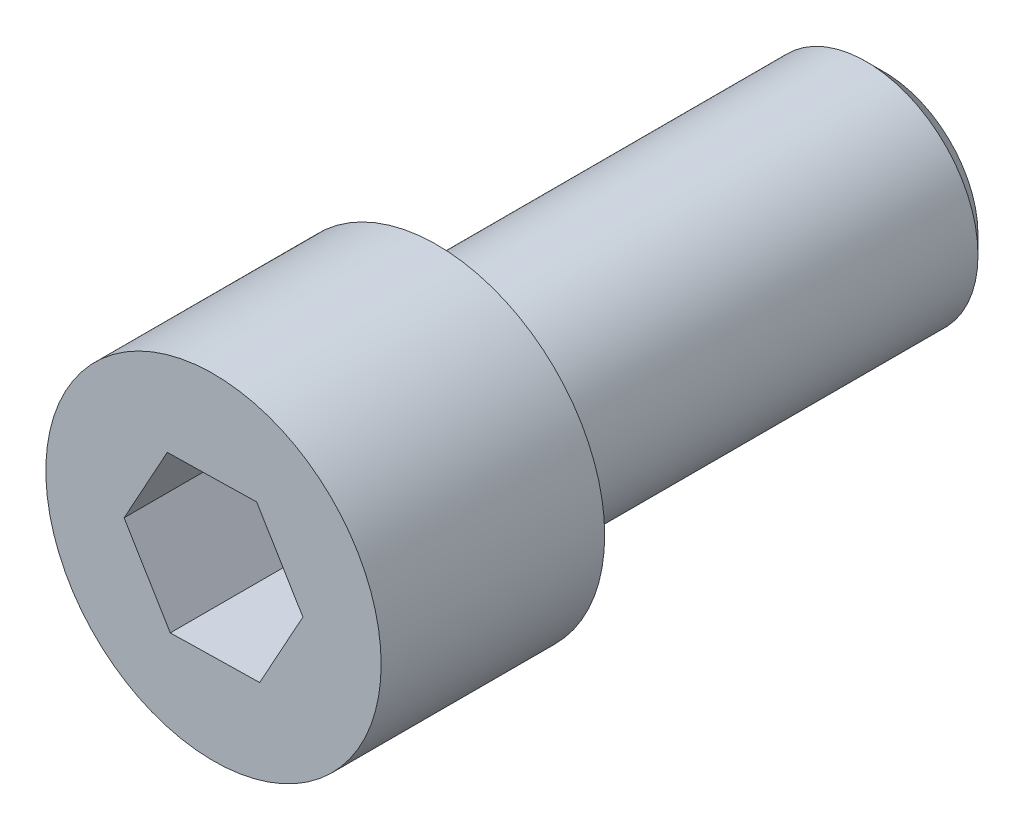
ISO-10303-21;
HEADER;
FILE_DESCRIPTION(('STEP AP214'),'2;1');
FILE_NAME('part.step','',(''),(''),'','','');
FILE_SCHEMA(('AUTOMOTIVE_DESIGN { 1 0 10303 214 1 1 1 1 }'));
ENDSEC;
DATA;
#1=APPLICATION_CONTEXT('core data for automotive mechanical design processes');
#2=APPLICATION_PROTOCOL_DEFINITION('international standard','automotive_design',2000,#1);
#3=PRODUCT_CONTEXT('',#1,'mechanical');
#4=PRODUCT('Part','Part','',(#3));
#5=PRODUCT_RELATED_PRODUCT_CATEGORY('part','',(#4));
#6=PRODUCT_DEFINITION_FORMATION('','',#4);
#7=PRODUCT_DEFINITION_CONTEXT('part definition',#1,'design');
#8=PRODUCT_DEFINITION('design','',#6,#7);
#9=PRODUCT_DEFINITION_SHAPE('','',#8);
#10=(LENGTH_UNIT() NAMED_UNIT(*) SI_UNIT(.MILLI.,.METRE.));
#11=(NAMED_UNIT(*) PLANE_ANGLE_UNIT() SI_UNIT($,.RADIAN.));
#12=(NAMED_UNIT(*) SI_UNIT($,.STERADIAN.) SOLID_ANGLE_UNIT());
#13=UNCERTAINTY_MEASURE_WITH_UNIT(LENGTH_MEASURE(1.E-05),#10,'distance_accuracy_value','');
#14=(GEOMETRIC_REPRESENTATION_CONTEXT(3) GLOBAL_UNCERTAINTY_ASSIGNED_CONTEXT((#13)) GLOBAL_UNIT_ASSIGNED_CONTEXT((#10,
#11,#12)) REPRESENTATION_CONTEXT('',''));
#15=CARTESIAN_POINT('',(0.,0.,0.));
#16=DIRECTION('',(0.,0.,1.));
#17=DIRECTION('',(1.,0.,0.));
#18=AXIS2_PLACEMENT_3D('',#15,#16,#17);
#19=CARTESIAN_POINT('',(-30.0924150638532,3.61445208867511,6.35));
#20=DIRECTION('',(0.,0.,-1.));
#21=DIRECTION('',(-1.,0.,0.));
#22=AXIS2_PLACEMENT_3D('',#19,#20,#21);
#23=CYLINDRICAL_SURFACE('',#22,4.7625);
#24=CARTESIAN_POINT('',(-30.0924150638532,3.61445208867511,6.35));
#25=DIRECTION('',(0.,0.,1.));
#26=DIRECTION('',(1.,0.,0.));
#27=AXIS2_PLACEMENT_3D('',#24,#25,#26);
#28=CIRCLE('',#27,4.7625);
#29=CARTESIAN_POINT('',(-25.3299150638532,3.61445208867511,6.35));
#30=VERTEX_POINT('',#29);
#31=EDGE_CURVE('E142',#30,#30,#28,.T.);
#32=ORIENTED_EDGE('',*,*,#31,.F.);
#33=EDGE_LOOP('',(#32));
#34=FACE_BOUND('',#33,.T.);
#35=CARTESIAN_POINT('',(-30.0924150638532,3.61445208867511,0.));
#36=DIRECTION('',(0.,0.,1.));
#37=DIRECTION('',(1.,0.,0.));
#38=AXIS2_PLACEMENT_3D('',#35,#36,#37);
#39=CIRCLE('',#38,4.7625);
#40=CARTESIAN_POINT('',(-25.3299150638532,3.61445208867511,0.));
#41=VERTEX_POINT('',#40);
#42=EDGE_CURVE('E136',#41,#41,#39,.T.);
#43=ORIENTED_EDGE('',*,*,#42,.T.);
#44=EDGE_LOOP('',(#43));
#45=FACE_BOUND('',#44,.T.);
#46=ADVANCED_FACE('F34',(#34,#45),#23,.T.);
#47=CARTESIAN_POINT('',(-30.0924150638532,3.61445208867511,6.35));
#48=DIRECTION('',(0.,0.,1.));
#49=DIRECTION('',(1.,0.,0.));
#50=AXIS2_PLACEMENT_3D('',#47,#48,#49);
#51=PLANE('',#50);
#52=DIRECTION('',(0.999814238001745,0.0192740625969401,0.));
#53=VECTOR('',#52,1.);
#54=CARTESIAN_POINT('',(-31.3197819033928,1.39067812507277,6.35));
#55=LINE('',#54,#53);
#56=CARTESIAN_POINT('',(-31.3197819033928,1.39067812507277,6.35));
#57=VERTEX_POINT('',#56);
#58=CARTESIAN_POINT('',(-28.7802537388683,1.439634244069,6.35));
#59=VERTEX_POINT('',#58);
#60=EDGE_CURVE('E49',#57,#59,#55,.T.);
#61=ORIENTED_EDGE('',*,*,#60,.F.);
#62=DIRECTION('',(0.516598946843954,-0.856227497876422,0.));
#63=VECTOR('',#62,1.);
#64=CARTESIAN_POINT('',(-32.6319432283764,3.56549596967889,6.35));
#65=LINE('',#64,#63);
#66=CARTESIAN_POINT('',(-32.6319432283764,3.56549596967889,6.35));
#67=VERTEX_POINT('',#66);
#68=EDGE_CURVE('E132',#67,#57,#65,.T.);
#69=ORIENTED_EDGE('',*,*,#68,.F.);
#70=DIRECTION('',(-0.483215291157794,-0.87550156047336,0.));
#71=VECTOR('',#70,1.);
#72=CARTESIAN_POINT('',(-31.4045763888356,5.78926993328122,6.35));
#73=LINE('',#72,#71);
#74=CARTESIAN_POINT('',(-31.4045763888356,5.78926993328122,6.35));
#75=VERTEX_POINT('',#74);
#76=EDGE_CURVE('E130',#75,#67,#73,.T.);
#77=ORIENTED_EDGE('',*,*,#76,.F.);
#78=DIRECTION('',(-0.999814238001745,-0.0192740625969398,0.));
#79=VECTOR('',#78,1.);
#80=CARTESIAN_POINT('',(-28.8650482243112,5.83822605227745,6.35));
#81=LINE('',#80,#79);
#82=CARTESIAN_POINT('',(-28.8650482243112,5.83822605227745,6.35));
#83=VERTEX_POINT('',#82);
#84=EDGE_CURVE('E97',#83,#75,#81,.T.);
#85=ORIENTED_EDGE('',*,*,#84,.F.);
#86=DIRECTION('',(-0.516598946843954,0.856227497876422,0.));
#87=VECTOR('',#86,1.);
#88=CARTESIAN_POINT('',(-27.5528868993275,3.66340820767134,6.35));
#89=LINE('',#88,#87);
#90=CARTESIAN_POINT('',(-27.5528868993275,3.66340820767134,6.35));
#91=VERTEX_POINT('',#90);
#92=EDGE_CURVE('E126',#91,#83,#89,.T.);
#93=ORIENTED_EDGE('',*,*,#92,.F.);
#94=DIRECTION('',(0.483215291157791,0.875501560473362,0.));
#95=VECTOR('',#94,1.);
#96=CARTESIAN_POINT('',(-28.7802537388683,1.439634244069,6.35));
#97=LINE('',#96,#95);
#98=EDGE_CURVE('E123',#59,#91,#97,.T.);
#99=ORIENTED_EDGE('',*,*,#98,.F.);
#100=EDGE_LOOP('',(#61,#69,#77,#85,#93,#99));
#101=FACE_BOUND('',#100,.T.);
#102=ORIENTED_EDGE('',*,*,#31,.T.);
#103=EDGE_LOOP('',(#102));
#104=FACE_BOUND('',#103,.T.);
#105=ADVANCED_FACE('F166',(#101,#104),#51,.T.);
#106=CARTESIAN_POINT('',(-30.0924150638532,3.61445208867511,0.));
#107=DIRECTION('',(0.,0.,1.));
#108=DIRECTION('',(1.,0.,0.));
#109=AXIS2_PLACEMENT_3D('',#106,#107,#108);
#110=PLANE('',#109);
#111=CARTESIAN_POINT('',(-30.0924150638532,3.61445208867511,0.));
#112=DIRECTION('',(0.,0.,1.));
#113=DIRECTION('',(1.,0.,0.));
#114=AXIS2_PLACEMENT_3D('',#111,#112,#113);
#115=CIRCLE('',#114,3.556);
#116=CARTESIAN_POINT('',(-26.5364150638532,3.61445208867511,0.));
#117=VERTEX_POINT('',#116);
#118=EDGE_CURVE('E150',#117,#117,#115,.T.);
#119=ORIENTED_EDGE('',*,*,#118,.T.);
#120=EDGE_LOOP('',(#119));
#121=FACE_BOUND('',#120,.T.);
#122=ORIENTED_EDGE('',*,*,#42,.F.);
#123=EDGE_LOOP('',(#122));
#124=FACE_BOUND('',#123,.T.);
#125=ADVANCED_FACE('F172',(#121,#124),#110,.F.);
#126=CARTESIAN_POINT('',(-31.3197819033928,1.39067812507277,2.54));
#127=DIRECTION('',(0.0192740625969401,-0.999814238001745,0.));
#128=DIRECTION('',(0.999814238001745,0.0192740625969401,0.));
#129=AXIS2_PLACEMENT_3D('',#126,#127,#128);
#130=PLANE('',#129);
#131=ORIENTED_EDGE('',*,*,#60,.T.);
#132=DIRECTION('',(0.,0.,1.));
#133=VECTOR('',#132,1.);
#134=CARTESIAN_POINT('',(-28.7802537388683,1.439634244069,2.54));
#135=LINE('',#134,#133);
#136=CARTESIAN_POINT('',(-28.7802537388683,1.439634244069,2.54));
#137=VERTEX_POINT('',#136);
#138=EDGE_CURVE('E79',#137,#59,#135,.T.);
#139=ORIENTED_EDGE('',*,*,#138,.F.);
#140=DIRECTION('',(0.999814238001745,0.0192740625969401,0.));
#141=VECTOR('',#140,1.);
#142=CARTESIAN_POINT('',(-31.3197819033928,1.39067812507277,2.54));
#143=LINE('',#142,#141);
#144=CARTESIAN_POINT('',(-31.3197819033928,1.39067812507277,2.54));
#145=VERTEX_POINT('',#144);
#146=EDGE_CURVE('E134',#145,#137,#143,.T.);
#147=ORIENTED_EDGE('',*,*,#146,.F.);
#148=DIRECTION('',(0.,0.,1.));
#149=VECTOR('',#148,1.);
#150=CARTESIAN_POINT('',(-31.3197819033928,1.39067812507277,2.54));
#151=LINE('',#150,#149);
#152=EDGE_CURVE('E57',#145,#57,#151,.T.);
#153=ORIENTED_EDGE('',*,*,#152,.T.);
#154=EDGE_LOOP('',(#131,#139,#147,#153));
#155=FACE_BOUND('',#154,.T.);
#156=ADVANCED_FACE('F179',(#155),#130,.F.);
#157=CARTESIAN_POINT('',(-32.6319432283764,3.56549596967889,2.54));
#158=DIRECTION('',(-0.856227497876422,-0.516598946843954,0.));
#159=DIRECTION('',(0.516598946843954,-0.856227497876422,0.));
#160=AXIS2_PLACEMENT_3D('',#157,#158,#159);
#161=PLANE('',#160);
#162=ORIENTED_EDGE('',*,*,#68,.T.);
#163=ORIENTED_EDGE('',*,*,#152,.F.);
#164=DIRECTION('',(0.516598946843954,-0.856227497876422,0.));
#165=VECTOR('',#164,1.);
#166=CARTESIAN_POINT('',(-32.6319432283764,3.56549596967889,2.54));
#167=LINE('',#166,#165);
#168=CARTESIAN_POINT('',(-32.6319432283764,3.56549596967889,2.54));
#169=VERTEX_POINT('',#168);
#170=EDGE_CURVE('E109',#169,#145,#167,.T.);
#171=ORIENTED_EDGE('',*,*,#170,.F.);
#172=DIRECTION('',(0.,0.,1.));
#173=VECTOR('',#172,1.);
#174=CARTESIAN_POINT('',(-32.6319432283764,3.56549596967889,2.54));
#175=LINE('',#174,#173);
#176=EDGE_CURVE('E101',#169,#67,#175,.T.);
#177=ORIENTED_EDGE('',*,*,#176,.T.);
#178=EDGE_LOOP('',(#162,#163,#171,#177));
#179=FACE_BOUND('',#178,.T.);
#180=ADVANCED_FACE('F184',(#179),#161,.F.);
#181=CARTESIAN_POINT('',(-31.4045763888356,5.78926993328122,2.54));
#182=DIRECTION('',(-0.87550156047336,0.483215291157795,0.));
#183=DIRECTION('',(-0.483215291157795,-0.87550156047336,0.));
#184=AXIS2_PLACEMENT_3D('',#181,#182,#183);
#185=PLANE('',#184);
#186=ORIENTED_EDGE('',*,*,#76,.T.);
#187=ORIENTED_EDGE('',*,*,#176,.F.);
#188=DIRECTION('',(-0.483215291157794,-0.87550156047336,0.));
#189=VECTOR('',#188,1.);
#190=CARTESIAN_POINT('',(-31.4045763888356,5.78926993328122,2.54));
#191=LINE('',#190,#189);
#192=CARTESIAN_POINT('',(-31.4045763888356,5.78926993328122,2.54));
#193=VERTEX_POINT('',#192);
#194=EDGE_CURVE('E105',#193,#169,#191,.T.);
#195=ORIENTED_EDGE('',*,*,#194,.F.);
#196=DIRECTION('',(0.,0.,1.));
#197=VECTOR('',#196,1.);
#198=CARTESIAN_POINT('',(-31.4045763888356,5.78926993328122,2.54));
#199=LINE('',#198,#197);
#200=EDGE_CURVE('E90',#193,#75,#199,.T.);
#201=ORIENTED_EDGE('',*,*,#200,.T.);
#202=EDGE_LOOP('',(#186,#187,#195,#201));
#203=FACE_BOUND('',#202,.T.);
#204=ADVANCED_FACE('F106',(#203),#185,.F.);
#205=CARTESIAN_POINT('',(-28.8650482243112,5.83822605227745,2.54));
#206=DIRECTION('',(-0.0192740625969398,0.999814238001745,0.));
#207=DIRECTION('',(-0.999814238001745,-0.0192740625969398,0.));
#208=AXIS2_PLACEMENT_3D('',#205,#206,#207);
#209=PLANE('',#208);
#210=ORIENTED_EDGE('',*,*,#84,.T.);
#211=ORIENTED_EDGE('',*,*,#200,.F.);
#212=DIRECTION('',(-0.999814238001745,-0.0192740625969398,0.));
#213=VECTOR('',#212,1.);
#214=CARTESIAN_POINT('',(-28.8650482243112,5.83822605227745,2.54));
#215=LINE('',#214,#213);
#216=CARTESIAN_POINT('',(-28.8650482243112,5.83822605227745,2.54));
#217=VERTEX_POINT('',#216);
#218=EDGE_CURVE('E94',#217,#193,#215,.T.);
#219=ORIENTED_EDGE('',*,*,#218,.F.);
#220=DIRECTION('',(0.,0.,1.));
#221=VECTOR('',#220,1.);
#222=CARTESIAN_POINT('',(-28.8650482243112,5.83822605227745,2.54));
#223=LINE('',#222,#221);
#224=EDGE_CURVE('E102',#217,#83,#223,.T.);
#225=ORIENTED_EDGE('',*,*,#224,.T.);
#226=EDGE_LOOP('',(#210,#211,#219,#225));
#227=FACE_BOUND('',#226,.T.);
#228=ADVANCED_FACE('F92',(#227),#209,.F.);
#229=CARTESIAN_POINT('',(-27.5528868993275,3.66340820767134,2.54));
#230=DIRECTION('',(0.856227497876422,0.516598946843954,0.));
#231=DIRECTION('',(-0.516598946843954,0.856227497876422,0.));
#232=AXIS2_PLACEMENT_3D('',#229,#230,#231);
#233=PLANE('',#232);
#234=ORIENTED_EDGE('',*,*,#92,.T.);
#235=ORIENTED_EDGE('',*,*,#224,.F.);
#236=DIRECTION('',(-0.516598946843954,0.856227497876422,0.));
#237=VECTOR('',#236,1.);
#238=CARTESIAN_POINT('',(-27.5528868993275,3.66340820767134,2.54));
#239=LINE('',#238,#237);
#240=CARTESIAN_POINT('',(-27.5528868993275,3.66340820767134,2.54));
#241=VERTEX_POINT('',#240);
#242=EDGE_CURVE('E115',#241,#217,#239,.T.);
#243=ORIENTED_EDGE('',*,*,#242,.F.);
#244=DIRECTION('',(0.,0.,1.));
#245=VECTOR('',#244,1.);
#246=CARTESIAN_POINT('',(-27.5528868993275,3.66340820767134,2.54));
#247=LINE('',#246,#245);
#248=EDGE_CURVE('E139',#241,#91,#247,.T.);
#249=ORIENTED_EDGE('',*,*,#248,.T.);
#250=EDGE_LOOP('',(#234,#235,#243,#249));
#251=FACE_BOUND('',#250,.T.);
#252=ADVANCED_FACE('F188',(#251),#233,.F.);
#253=CARTESIAN_POINT('',(-28.7802537388683,1.439634244069,2.54));
#254=DIRECTION('',(0.875501560473362,-0.48321529115779,0.));
#255=DIRECTION('',(0.483215291157791,0.875501560473362,0.));
#256=AXIS2_PLACEMENT_3D('',#253,#254,#255);
#257=PLANE('',#256);
#258=ORIENTED_EDGE('',*,*,#98,.T.);
#259=ORIENTED_EDGE('',*,*,#248,.F.);
#260=DIRECTION('',(0.483215291157791,0.875501560473362,0.));
#261=VECTOR('',#260,1.);
#262=CARTESIAN_POINT('',(-28.7802537388683,1.439634244069,2.54));
#263=LINE('',#262,#261);
#264=EDGE_CURVE('E117',#137,#241,#263,.T.);
#265=ORIENTED_EDGE('',*,*,#264,.F.);
#266=ORIENTED_EDGE('',*,*,#138,.T.);
#267=EDGE_LOOP('',(#258,#259,#265,#266));
#268=FACE_BOUND('',#267,.T.);
#269=ADVANCED_FACE('F185',(#268),#257,.F.);
#270=CARTESIAN_POINT('',(0.,0.,2.54));
#271=DIRECTION('',(0.,0.,1.));
#272=DIRECTION('',(1.,0.,0.));
#273=AXIS2_PLACEMENT_3D('',#270,#271,#272);
#274=PLANE('',#273);
#275=ORIENTED_EDGE('',*,*,#146,.T.);
#276=ORIENTED_EDGE('',*,*,#264,.T.);
#277=ORIENTED_EDGE('',*,*,#242,.T.);
#278=ORIENTED_EDGE('',*,*,#218,.T.);
#279=ORIENTED_EDGE('',*,*,#194,.T.);
#280=ORIENTED_EDGE('',*,*,#170,.T.);
#281=EDGE_LOOP('',(#275,#276,#277,#278,#279,#280));
#282=FACE_BOUND('',#281,.T.);
#283=ADVANCED_FACE('F112',(#282),#274,.T.);
#284=CARTESIAN_POINT('',(-30.0924150638532,3.61445208867511,-12.7));
#285=DIRECTION('',(0.,0.,1.));
#286=DIRECTION('',(1.,0.,0.));
#287=AXIS2_PLACEMENT_3D('',#284,#285,#286);
#288=CYLINDRICAL_SURFACE('',#287,3.175);
#289=CARTESIAN_POINT('',(-30.0924150638532,3.61445208867511,-12.192));
#290=DIRECTION('',(0.,0.,-1.));
#291=DIRECTION('',(-1.,0.,0.));
#292=AXIS2_PLACEMENT_3D('',#289,#290,#291);
#293=CIRCLE('',#292,3.175);
#294=CARTESIAN_POINT('',(-33.2674150638532,3.61445208867511,-12.192));
#295=VERTEX_POINT('',#294);
#296=EDGE_CURVE('E11',#295,#295,#293,.F.);
#297=ORIENTED_EDGE('',*,*,#296,.T.);
#298=EDGE_LOOP('',(#297));
#299=FACE_BOUND('',#298,.T.);
#300=CARTESIAN_POINT('',(-30.0924150638532,3.61445208867511,-0.380999999999999));
#301=DIRECTION('',(0.,0.,1.));
#302=DIRECTION('',(1.,0.,0.));
#303=AXIS2_PLACEMENT_3D('',#300,#301,#302);
#304=CIRCLE('',#303,3.175);
#305=CARTESIAN_POINT('',(-26.9174150638532,3.61445208867511,-0.380999999999999));
#306=VERTEX_POINT('',#305);
#307=EDGE_CURVE('E145',#306,#306,#304,.F.);
#308=ORIENTED_EDGE('',*,*,#307,.T.);
#309=EDGE_LOOP('',(#308));
#310=FACE_BOUND('',#309,.T.);
#311=ADVANCED_FACE('F201',(#299,#310),#288,.T.);
#312=CARTESIAN_POINT('',(-30.0924150638532,3.61445208867511,-12.7));
#313=DIRECTION('',(0.,0.,-1.));
#314=DIRECTION('',(-1.,0.,0.));
#315=AXIS2_PLACEMENT_3D('',#312,#313,#314);
#316=PLANE('',#315);
#317=CARTESIAN_POINT('',(-30.0924150638532,3.61445208867511,-12.7));
#318=DIRECTION('',(0.,0.,-1.));
#319=DIRECTION('',(-1.,0.,0.));
#320=AXIS2_PLACEMENT_3D('',#317,#318,#319);
#321=CIRCLE('',#320,2.667);
#322=CARTESIAN_POINT('',(-32.7594150638532,3.61445208867511,-12.7));
#323=VERTEX_POINT('',#322);
#324=EDGE_CURVE('E42',#323,#323,#321,.T.);
#325=ORIENTED_EDGE('',*,*,#324,.T.);
#326=EDGE_LOOP('',(#325));
#327=FACE_BOUND('',#326,.T.);
#328=ADVANCED_FACE('F155',(#327),#316,.T.);
#329=CARTESIAN_POINT('',(-30.0924150638532,3.61445208867511,-0.380999999999999));
#330=DIRECTION('',(0.,0.,1.));
#331=DIRECTION('',(1.,0.,0.));
#332=AXIS2_PLACEMENT_3D('',#329,#330,#331);
#333=TOROIDAL_SURFACE('',#332,3.556,0.381);
#334=ORIENTED_EDGE('',*,*,#118,.F.);
#335=EDGE_LOOP('',(#334));
#336=FACE_BOUND('',#335,.T.);
#337=ORIENTED_EDGE('',*,*,#307,.F.);
#338=EDGE_LOOP('',(#337));
#339=FACE_BOUND('',#338,.T.);
#340=ADVANCED_FACE('F158',(#336,#339),#333,.F.);
#341=CARTESIAN_POINT('',(-30.0924150638532,3.61445208867511,-12.7));
#342=DIRECTION('',(0.,0.,1.));
#343=DIRECTION('',(1.,0.,0.));
#344=AXIS2_PLACEMENT_3D('',#341,#342,#343);
#345=CONICAL_SURFACE('',#344,2.667,0.785398163397444);
#346=ORIENTED_EDGE('',*,*,#296,.F.);
#347=EDGE_LOOP('',(#346));
#348=FACE_BOUND('',#347,.T.);
#349=ORIENTED_EDGE('',*,*,#324,.F.);
#350=EDGE_LOOP('',(#349));
#351=FACE_BOUND('',#350,.T.);
#352=ADVANCED_FACE('F36',(#348,#351),#345,.T.);
#353=CLOSED_SHELL('',(#46,#105,#125,#156,#180,#204,#228,#252,#269,#283,#311,#328,#340,#352));
#354=MANIFOLD_SOLID_BREP('B2',#353);
#355=ADVANCED_BREP_SHAPE_REPRESENTATION('',(#18,#354),#14);
#356=SHAPE_DEFINITION_REPRESENTATION(#9,#355);
ENDSEC;
END-ISO-10303-21;
